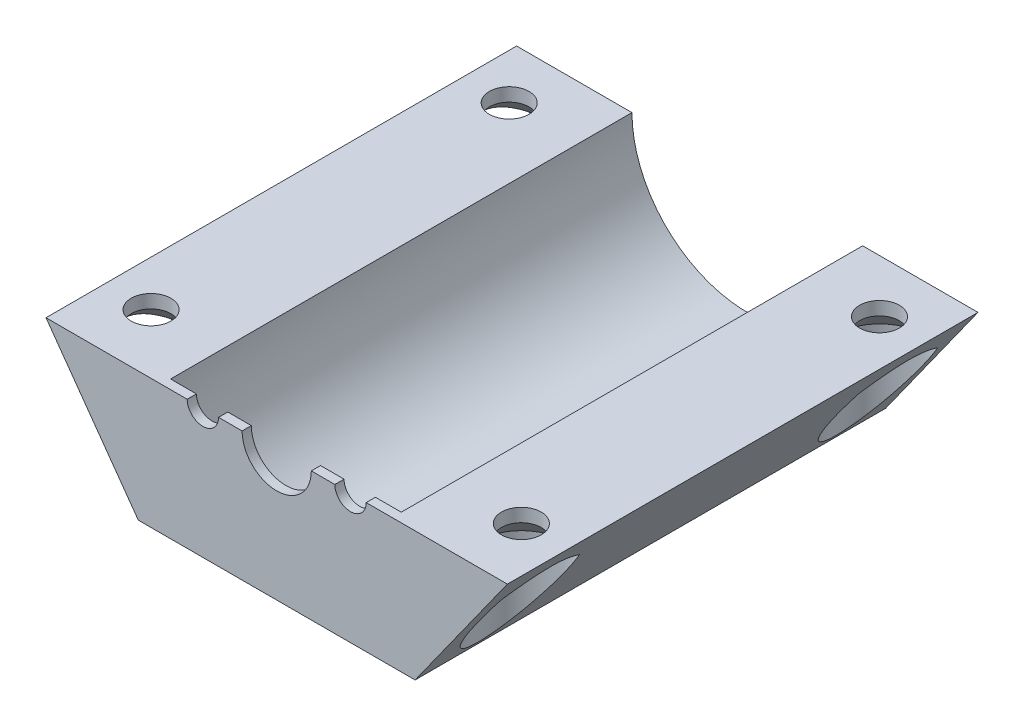
ISO-10303-21;
HEADER;
FILE_DESCRIPTION(('STEP AP214'),'2;1');
FILE_NAME('part.step','',(''),(''),'','','');
FILE_SCHEMA(('AUTOMOTIVE_DESIGN { 1 0 10303 214 1 1 1 1 }'));
ENDSEC;
DATA;
#1=APPLICATION_CONTEXT('core data for automotive mechanical design processes');
#2=APPLICATION_PROTOCOL_DEFINITION('international standard','automotive_design',2000,#1);
#3=PRODUCT_CONTEXT('',#1,'mechanical');
#4=PRODUCT('Part','Part','',(#3));
#5=PRODUCT_RELATED_PRODUCT_CATEGORY('part','',(#4));
#6=PRODUCT_DEFINITION_FORMATION('','',#4);
#7=PRODUCT_DEFINITION_CONTEXT('part definition',#1,'design');
#8=PRODUCT_DEFINITION('design','',#6,#7);
#9=PRODUCT_DEFINITION_SHAPE('','',#8);
#10=(LENGTH_UNIT() NAMED_UNIT(*) SI_UNIT(.MILLI.,.METRE.));
#11=(NAMED_UNIT(*) PLANE_ANGLE_UNIT() SI_UNIT($,.RADIAN.));
#12=(NAMED_UNIT(*) SI_UNIT($,.STERADIAN.) SOLID_ANGLE_UNIT());
#13=UNCERTAINTY_MEASURE_WITH_UNIT(LENGTH_MEASURE(1.E-05),#10,'distance_accuracy_value','');
#14=(GEOMETRIC_REPRESENTATION_CONTEXT(3) GLOBAL_UNCERTAINTY_ASSIGNED_CONTEXT((#13)) GLOBAL_UNIT_ASSIGNED_CONTEXT((#10,
#11,#12)) REPRESENTATION_CONTEXT('',''));
#15=CARTESIAN_POINT('',(0.,0.,0.));
#16=DIRECTION('',(0.,0.,1.));
#17=DIRECTION('',(1.,0.,0.));
#18=AXIS2_PLACEMENT_3D('',#15,#16,#17);
#19=CARTESIAN_POINT('',(0.,0.,0.));
#20=DIRECTION('',(0.,1.,0.));
#21=DIRECTION('',(0.,0.,1.));
#22=AXIS2_PLACEMENT_3D('',#19,#20,#21);
#23=PLANE('',#22);
#24=DIRECTION('',(0.,0.,-1.));
#25=VECTOR('',#24,1.);
#26=CARTESIAN_POINT('',(3.75,0.,51.));
#27=LINE('',#26,#25);
#28=CARTESIAN_POINT('',(3.75,0.,51.));
#29=VERTEX_POINT('',#28);
#30=CARTESIAN_POINT('',(3.75,0.,50.));
#31=VERTEX_POINT('',#30);
#32=EDGE_CURVE('E231',#29,#31,#27,.T.);
#33=ORIENTED_EDGE('',*,*,#32,.F.);
#34=DIRECTION('',(-1.,0.,0.));
#35=VECTOR('',#34,1.);
#36=CARTESIAN_POINT('',(0.,0.,51.));
#37=LINE('',#36,#35);
#38=CARTESIAN_POINT('',(6.3,0.,51.));
#39=VERTEX_POINT('',#38);
#40=EDGE_CURVE('E176',#39,#29,#37,.T.);
#41=ORIENTED_EDGE('',*,*,#40,.F.);
#42=DIRECTION('',(0.,0.,1.));
#43=VECTOR('',#42,1.);
#44=CARTESIAN_POINT('',(6.30000000000001,0.,51.));
#45=LINE('',#44,#43);
#46=CARTESIAN_POINT('',(6.30000000000001,0.,50.));
#47=VERTEX_POINT('',#46);
#48=EDGE_CURVE('E256',#39,#47,#45,.F.);
#49=ORIENTED_EDGE('',*,*,#48,.T.);
#50=DIRECTION('',(-1.,0.,0.));
#51=VECTOR('',#50,1.);
#52=CARTESIAN_POINT('',(0.,0.,50.));
#53=LINE('',#52,#51);
#54=EDGE_CURVE('E224',#47,#31,#53,.T.);
#55=ORIENTED_EDGE('',*,*,#54,.T.);
#56=EDGE_LOOP('',(#33,#41,#49,#55));
#57=FACE_BOUND('',#56,.T.);
#58=ADVANCED_FACE('F41',(#57),#23,.T.);
#59=CARTESIAN_POINT('',(20.0634652174544,0.,44.5527588301009));
#60=DIRECTION('',(0.,1.,0.));
#61=DIRECTION('',(0.,0.,1.));
#62=AXIS2_PLACEMENT_3D('',#59,#60,#61);
#63=CIRCLE('',#62,2.15);
#64=CARTESIAN_POINT('',(20.0634652174544,0.,46.7027588301009));
#65=VERTEX_POINT('',#64);
#66=EDGE_CURVE('E243',#65,#65,#63,.F.);
#67=ORIENTED_EDGE('',*,*,#66,.T.);
#68=EDGE_LOOP('',(#67));
#69=FACE_BOUND('',#68,.T.);
#70=DIRECTION('',(0.,0.,-1.));
#71=VECTOR('',#70,1.);
#72=CARTESIAN_POINT('',(25.,0.,50.));
#73=LINE('',#72,#71);
#74=CARTESIAN_POINT('',(25.,0.,51.));
#75=VERTEX_POINT('',#74);
#76=CARTESIAN_POINT('',(25.,0.,0.));
#77=VERTEX_POINT('',#76);
#78=EDGE_CURVE('E172',#75,#77,#73,.T.);
#79=ORIENTED_EDGE('',*,*,#78,.T.);
#80=DIRECTION('',(-1.,0.,0.));
#81=VECTOR('',#80,1.);
#82=CARTESIAN_POINT('',(0.,0.,0.));
#83=LINE('',#82,#81);
#84=CARTESIAN_POINT('',(12.5,0.,0.));
#85=VERTEX_POINT('',#84);
#86=EDGE_CURVE('E240',#77,#85,#83,.T.);
#87=ORIENTED_EDGE('',*,*,#86,.T.);
#88=DIRECTION('',(0.,0.,-1.));
#89=VECTOR('',#88,1.);
#90=CARTESIAN_POINT('',(12.5,0.,50.));
#91=LINE('',#90,#89);
#92=CARTESIAN_POINT('',(12.5,0.,50.));
#93=VERTEX_POINT('',#92);
#94=EDGE_CURVE('E237',#93,#85,#91,.T.);
#95=ORIENTED_EDGE('',*,*,#94,.F.);
#96=CARTESIAN_POINT('',(9.69999999999999,0.,50.));
#97=VERTEX_POINT('',#96);
#98=EDGE_CURVE('E254',#93,#97,#53,.T.);
#99=ORIENTED_EDGE('',*,*,#98,.T.);
#100=DIRECTION('',(0.,0.,1.));
#101=VECTOR('',#100,1.);
#102=CARTESIAN_POINT('',(9.69999999999999,0.,51.));
#103=LINE('',#102,#101);
#104=CARTESIAN_POINT('',(9.7,0.,51.));
#105=VERTEX_POINT('',#104);
#106=EDGE_CURVE('E175',#97,#105,#103,.T.);
#107=ORIENTED_EDGE('',*,*,#106,.T.);
#108=EDGE_CURVE('E159',#75,#105,#37,.T.);
#109=ORIENTED_EDGE('',*,*,#108,.F.);
#110=EDGE_LOOP('',(#79,#87,#95,#99,#107,#109));
#111=FACE_BOUND('',#110,.T.);
#112=CARTESIAN_POINT('',(20.0634652174544,0.,5.73907339124369));
#113=DIRECTION('',(0.,1.,0.));
#114=DIRECTION('',(0.,0.,1.));
#115=AXIS2_PLACEMENT_3D('',#112,#113,#114);
#116=CIRCLE('',#115,2.15);
#117=CARTESIAN_POINT('',(20.0634652174544,0.,7.88907339124369));
#118=VERTEX_POINT('',#117);
#119=EDGE_CURVE('E252',#118,#118,#116,.F.);
#120=ORIENTED_EDGE('',*,*,#119,.T.);
#121=EDGE_LOOP('',(#120));
#122=FACE_BOUND('',#121,.T.);
#123=ADVANCED_FACE('F169',(#69,#111,#122),#23,.T.);
#124=CARTESIAN_POINT('',(-20.0634652174544,0.,44.5527588301009));
#125=DIRECTION('',(0.,1.,0.));
#126=DIRECTION('',(0.,0.,1.));
#127=AXIS2_PLACEMENT_3D('',#124,#125,#126);
#128=CIRCLE('',#127,2.15);
#129=CARTESIAN_POINT('',(-20.0634652174544,0.,46.7027588301009));
#130=VERTEX_POINT('',#129);
#131=EDGE_CURVE('E246',#130,#130,#128,.F.);
#132=ORIENTED_EDGE('',*,*,#131,.T.);
#133=EDGE_LOOP('',(#132));
#134=FACE_BOUND('',#133,.T.);
#135=DIRECTION('',(0.,0.,-1.));
#136=VECTOR('',#135,1.);
#137=CARTESIAN_POINT('',(-12.5,0.,50.));
#138=LINE('',#137,#136);
#139=CARTESIAN_POINT('',(-12.5,0.,0.));
#140=VERTEX_POINT('',#139);
#141=CARTESIAN_POINT('',(-12.5,0.,50.));
#142=VERTEX_POINT('',#141);
#143=EDGE_CURVE('E177',#140,#142,#138,.F.);
#144=ORIENTED_EDGE('',*,*,#143,.F.);
#145=CARTESIAN_POINT('',(-25.,0.,0.));
#146=VERTEX_POINT('',#145);
#147=EDGE_CURVE('E241',#140,#146,#83,.T.);
#148=ORIENTED_EDGE('',*,*,#147,.T.);
#149=DIRECTION('',(0.,0.,-1.));
#150=VECTOR('',#149,1.);
#151=CARTESIAN_POINT('',(-25.,0.,50.));
#152=LINE('',#151,#150);
#153=CARTESIAN_POINT('',(-25.,0.,51.));
#154=VERTEX_POINT('',#153);
#155=EDGE_CURVE('E56',#154,#146,#152,.T.);
#156=ORIENTED_EDGE('',*,*,#155,.F.);
#157=CARTESIAN_POINT('',(-9.7,0.,51.));
#158=VERTEX_POINT('',#157);
#159=EDGE_CURVE('E179',#158,#154,#37,.T.);
#160=ORIENTED_EDGE('',*,*,#159,.F.);
#161=DIRECTION('',(0.,0.,1.));
#162=VECTOR('',#161,1.);
#163=CARTESIAN_POINT('',(-9.69999999999999,0.,51.));
#164=LINE('',#163,#162);
#165=CARTESIAN_POINT('',(-9.69999999999999,0.,50.));
#166=VERTEX_POINT('',#165);
#167=EDGE_CURVE('E187',#158,#166,#164,.F.);
#168=ORIENTED_EDGE('',*,*,#167,.T.);
#169=EDGE_CURVE('E215',#166,#142,#53,.T.);
#170=ORIENTED_EDGE('',*,*,#169,.T.);
#171=EDGE_LOOP('',(#144,#148,#156,#160,#168,#170));
#172=FACE_BOUND('',#171,.T.);
#173=CARTESIAN_POINT('',(-20.0634652174544,0.,5.73907339124369));
#174=DIRECTION('',(0.,1.,0.));
#175=DIRECTION('',(0.,0.,1.));
#176=AXIS2_PLACEMENT_3D('',#173,#174,#175);
#177=CIRCLE('',#176,2.15);
#178=CARTESIAN_POINT('',(-20.0634652174544,0.,7.88907339124369));
#179=VERTEX_POINT('',#178);
#180=EDGE_CURVE('E249',#179,#179,#177,.F.);
#181=ORIENTED_EDGE('',*,*,#180,.T.);
#182=EDGE_LOOP('',(#181));
#183=FACE_BOUND('',#182,.T.);
#184=ADVANCED_FACE('F260',(#134,#172,#183),#23,.T.);
#185=DIRECTION('',(0.,0.,-1.));
#186=VECTOR('',#185,1.);
#187=CARTESIAN_POINT('',(-3.75,0.,51.));
#188=LINE('',#187,#186);
#189=CARTESIAN_POINT('',(-3.75,0.,50.));
#190=VERTEX_POINT('',#189);
#191=CARTESIAN_POINT('',(-3.75,0.,51.));
#192=VERTEX_POINT('',#191);
#193=EDGE_CURVE('E223',#190,#192,#188,.F.);
#194=ORIENTED_EDGE('',*,*,#193,.F.);
#195=CARTESIAN_POINT('',(-6.30000000000001,0.,50.));
#196=VERTEX_POINT('',#195);
#197=EDGE_CURVE('E212',#190,#196,#53,.T.);
#198=ORIENTED_EDGE('',*,*,#197,.T.);
#199=DIRECTION('',(0.,0.,1.));
#200=VECTOR('',#199,1.);
#201=CARTESIAN_POINT('',(-6.30000000000001,0.,51.));
#202=LINE('',#201,#200);
#203=CARTESIAN_POINT('',(-6.3,0.,51.));
#204=VERTEX_POINT('',#203);
#205=EDGE_CURVE('E184',#196,#204,#202,.T.);
#206=ORIENTED_EDGE('',*,*,#205,.T.);
#207=EDGE_CURVE('E229',#192,#204,#37,.T.);
#208=ORIENTED_EDGE('',*,*,#207,.F.);
#209=EDGE_LOOP('',(#194,#198,#206,#208));
#210=FACE_BOUND('',#209,.T.);
#211=ADVANCED_FACE('F221',(#210),#23,.T.);
#212=CARTESIAN_POINT('',(0.,0.,50.));
#213=DIRECTION('',(0.,0.,-1.));
#214=DIRECTION('',(-1.,0.,0.));
#215=AXIS2_PLACEMENT_3D('',#212,#213,#214);
#216=CYLINDRICAL_SURFACE('',#215,12.5);
#217=CARTESIAN_POINT('',(0.,0.,50.));
#218=DIRECTION('',(0.,0.,1.));
#219=DIRECTION('',(1.,0.,0.));
#220=AXIS2_PLACEMENT_3D('',#217,#218,#219);
#221=CIRCLE('',#220,12.5);
#222=EDGE_CURVE('E165',#142,#93,#221,.T.);
#223=ORIENTED_EDGE('',*,*,#222,.T.);
#224=ORIENTED_EDGE('',*,*,#94,.T.);
#225=CARTESIAN_POINT('',(0.,0.,0.));
#226=DIRECTION('',(0.,0.,1.));
#227=DIRECTION('',(1.,0.,0.));
#228=AXIS2_PLACEMENT_3D('',#225,#226,#227);
#229=CIRCLE('',#228,12.5);
#230=EDGE_CURVE('E191',#140,#85,#229,.T.);
#231=ORIENTED_EDGE('',*,*,#230,.F.);
#232=ORIENTED_EDGE('',*,*,#143,.T.);
#233=EDGE_LOOP('',(#223,#224,#231,#232));
#234=FACE_BOUND('',#233,.T.);
#235=ADVANCED_FACE('F289',(#234),#216,.F.);
#236=CARTESIAN_POINT('',(0.,0.,0.));
#237=DIRECTION('',(0.,0.,1.));
#238=DIRECTION('',(1.,0.,0.));
#239=AXIS2_PLACEMENT_3D('',#236,#237,#238);
#240=PLANE('',#239);
#241=ORIENTED_EDGE('',*,*,#86,.F.);
#242=DIRECTION('',(0.581238193719096,0.813733471206735,0.));
#243=VECTOR('',#242,1.);
#244=CARTESIAN_POINT('',(16.5540540540541,-11.8243243243243,0.));
#245=LINE('',#244,#243);
#246=CARTESIAN_POINT('',(15.,-14.,0.));
#247=VERTEX_POINT('',#246);
#248=EDGE_CURVE('E182',#247,#77,#245,.T.);
#249=ORIENTED_EDGE('',*,*,#248,.F.);
#250=DIRECTION('',(-1.,0.,0.));
#251=VECTOR('',#250,1.);
#252=CARTESIAN_POINT('',(0.,-14.,0.));
#253=LINE('',#252,#251);
#254=CARTESIAN_POINT('',(-15.,-14.,0.));
#255=VERTEX_POINT('',#254);
#256=EDGE_CURVE('E572',#247,#255,#253,.T.);
#257=ORIENTED_EDGE('',*,*,#256,.T.);
#258=DIRECTION('',(0.581238193719096,-0.813733471206735,0.));
#259=VECTOR('',#258,1.);
#260=CARTESIAN_POINT('',(-16.5540540540541,-11.8243243243243,0.));
#261=LINE('',#260,#259);
#262=EDGE_CURVE('E568',#146,#255,#261,.T.);
#263=ORIENTED_EDGE('',*,*,#262,.F.);
#264=ORIENTED_EDGE('',*,*,#147,.F.);
#265=ORIENTED_EDGE('',*,*,#230,.T.);
#266=EDGE_LOOP('',(#241,#249,#257,#263,#264,#265));
#267=FACE_BOUND('',#266,.T.);
#268=ADVANCED_FACE('F43',(#267),#240,.F.);
#269=CARTESIAN_POINT('',(20.0634652174544,-14.,44.5527588301009));
#270=DIRECTION('',(0.,-1.,0.));
#271=DIRECTION('',(0.,0.,-1.));
#272=AXIS2_PLACEMENT_3D('',#269,#270,#271);
#273=CYLINDRICAL_SURFACE('',#272,2.15);
#274=CARTESIAN_POINT('',(20.0634652174544,-1.45,44.5527588301009));
#275=DIRECTION('',(0.,-1.,0.));
#276=DIRECTION('',(0.,0.,-1.));
#277=AXIS2_PLACEMENT_3D('',#274,#275,#276);
#278=CIRCLE('',#277,2.15);
#279=CARTESIAN_POINT('',(20.0634652174544,-1.45,42.4027588301009));
#280=VERTEX_POINT('',#279);
#281=EDGE_CURVE('E566',#280,#280,#278,.T.);
#282=ORIENTED_EDGE('',*,*,#281,.T.);
#283=EDGE_LOOP('',(#282));
#284=FACE_BOUND('',#283,.T.);
#285=ORIENTED_EDGE('',*,*,#66,.F.);
#286=EDGE_LOOP('',(#285));
#287=FACE_BOUND('',#286,.T.);
#288=ADVANCED_FACE('F297',(#284,#287),#273,.F.);
#289=CARTESIAN_POINT('',(-20.0634652174544,-14.,44.5527588301009));
#290=DIRECTION('',(0.,-1.,0.));
#291=DIRECTION('',(0.,0.,-1.));
#292=AXIS2_PLACEMENT_3D('',#289,#290,#291);
#293=CYLINDRICAL_SURFACE('',#292,2.15);
#294=CARTESIAN_POINT('',(-20.0634652174544,-1.45000000000001,44.5527588301009));
#295=DIRECTION('',(0.,-1.,0.));
#296=DIRECTION('',(0.,0.,-1.));
#297=AXIS2_PLACEMENT_3D('',#294,#295,#296);
#298=CIRCLE('',#297,2.15);
#299=CARTESIAN_POINT('',(-20.0634652174544,-1.45000000000001,42.4027588301009));
#300=VERTEX_POINT('',#299);
#301=EDGE_CURVE('E570',#300,#300,#298,.T.);
#302=ORIENTED_EDGE('',*,*,#301,.T.);
#303=EDGE_LOOP('',(#302));
#304=FACE_BOUND('',#303,.T.);
#305=ORIENTED_EDGE('',*,*,#131,.F.);
#306=EDGE_LOOP('',(#305));
#307=FACE_BOUND('',#306,.T.);
#308=ADVANCED_FACE('F474',(#304,#307),#293,.F.);
#309=CARTESIAN_POINT('',(-20.0634652174544,-14.,5.73907339124369));
#310=DIRECTION('',(0.,-1.,0.));
#311=DIRECTION('',(0.,0.,-1.));
#312=AXIS2_PLACEMENT_3D('',#309,#310,#311);
#313=CYLINDRICAL_SURFACE('',#312,2.15);
#314=CARTESIAN_POINT('',(-20.0634652174544,-1.45000000000001,5.73907339124369));
#315=DIRECTION('',(0.,-1.,0.));
#316=DIRECTION('',(0.,0.,-1.));
#317=AXIS2_PLACEMENT_3D('',#314,#315,#316);
#318=CIRCLE('',#317,2.15);
#319=CARTESIAN_POINT('',(-20.0634652174544,-1.45000000000001,3.58907339124369));
#320=VERTEX_POINT('',#319);
#321=EDGE_CURVE('E580',#320,#320,#318,.T.);
#322=ORIENTED_EDGE('',*,*,#321,.T.);
#323=EDGE_LOOP('',(#322));
#324=FACE_BOUND('',#323,.T.);
#325=ORIENTED_EDGE('',*,*,#180,.F.);
#326=EDGE_LOOP('',(#325));
#327=FACE_BOUND('',#326,.T.);
#328=ADVANCED_FACE('F463',(#324,#327),#313,.F.);
#329=CARTESIAN_POINT('',(20.0634652174544,-14.,5.73907339124369));
#330=DIRECTION('',(0.,-1.,0.));
#331=DIRECTION('',(0.,0.,-1.));
#332=AXIS2_PLACEMENT_3D('',#329,#330,#331);
#333=CYLINDRICAL_SURFACE('',#332,2.15);
#334=CARTESIAN_POINT('',(20.0634652174544,-1.45,5.73907339124369));
#335=DIRECTION('',(0.,-1.,0.));
#336=DIRECTION('',(0.,0.,-1.));
#337=AXIS2_PLACEMENT_3D('',#334,#335,#336);
#338=CIRCLE('',#337,2.15);
#339=CARTESIAN_POINT('',(20.0634652174544,-1.45,3.58907339124369));
#340=VERTEX_POINT('',#339);
#341=EDGE_CURVE('E585',#340,#340,#338,.T.);
#342=ORIENTED_EDGE('',*,*,#341,.T.);
#343=EDGE_LOOP('',(#342));
#344=FACE_BOUND('',#343,.T.);
#345=ORIENTED_EDGE('',*,*,#119,.F.);
#346=EDGE_LOOP('',(#345));
#347=FACE_BOUND('',#346,.T.);
#348=ADVANCED_FACE('F304',(#344,#347),#333,.F.);
#349=CARTESIAN_POINT('',(0.,0.,50.));
#350=DIRECTION('',(0.,0.,1.));
#351=DIRECTION('',(1.,0.,0.));
#352=AXIS2_PLACEMENT_3D('',#349,#350,#351);
#353=PLANE('',#352);
#354=ORIENTED_EDGE('',*,*,#98,.F.);
#355=ORIENTED_EDGE('',*,*,#222,.F.);
#356=ORIENTED_EDGE('',*,*,#169,.F.);
#357=CARTESIAN_POINT('',(-8.,0.,50.));
#358=DIRECTION('',(0.,0.,1.));
#359=DIRECTION('',(1.,0.,0.));
#360=AXIS2_PLACEMENT_3D('',#357,#358,#359);
#361=CIRCLE('',#360,1.69999999999999);
#362=EDGE_CURVE('E49',#166,#196,#361,.T.);
#363=ORIENTED_EDGE('',*,*,#362,.T.);
#364=ORIENTED_EDGE('',*,*,#197,.F.);
#365=CARTESIAN_POINT('',(0.,0.,50.));
#366=DIRECTION('',(0.,0.,1.));
#367=DIRECTION('',(1.,0.,0.));
#368=AXIS2_PLACEMENT_3D('',#365,#366,#367);
#369=CIRCLE('',#368,3.75);
#370=EDGE_CURVE('E199',#190,#31,#369,.T.);
#371=ORIENTED_EDGE('',*,*,#370,.T.);
#372=ORIENTED_EDGE('',*,*,#54,.F.);
#373=CARTESIAN_POINT('',(8.,0.,50.));
#374=DIRECTION('',(0.,0.,1.));
#375=DIRECTION('',(1.,0.,0.));
#376=AXIS2_PLACEMENT_3D('',#373,#374,#375);
#377=CIRCLE('',#376,1.69999999999999);
#378=EDGE_CURVE('E203',#47,#97,#377,.T.);
#379=ORIENTED_EDGE('',*,*,#378,.T.);
#380=EDGE_LOOP('',(#354,#355,#356,#363,#364,#371,#372,#379));
#381=FACE_BOUND('',#380,.T.);
#382=ADVANCED_FACE('F211',(#381),#353,.F.);
#383=CARTESIAN_POINT('',(0.,0.,51.));
#384=DIRECTION('',(0.,0.,1.));
#385=DIRECTION('',(1.,0.,0.));
#386=AXIS2_PLACEMENT_3D('',#383,#384,#385);
#387=PLANE('',#386);
#388=DIRECTION('',(0.581238193719096,0.813733471206735,0.));
#389=VECTOR('',#388,1.);
#390=CARTESIAN_POINT('',(15.,-14.,51.));
#391=LINE('',#390,#389);
#392=CARTESIAN_POINT('',(15.,-14.,51.));
#393=VERTEX_POINT('',#392);
#394=EDGE_CURVE('E156',#393,#75,#391,.T.);
#395=ORIENTED_EDGE('',*,*,#394,.T.);
#396=ORIENTED_EDGE('',*,*,#108,.T.);
#397=CARTESIAN_POINT('',(8.,0.,51.));
#398=DIRECTION('',(0.,0.,1.));
#399=DIRECTION('',(1.,0.,0.));
#400=AXIS2_PLACEMENT_3D('',#397,#398,#399);
#401=CIRCLE('',#400,1.7);
#402=EDGE_CURVE('E205',#39,#105,#401,.T.);
#403=ORIENTED_EDGE('',*,*,#402,.F.);
#404=ORIENTED_EDGE('',*,*,#40,.T.);
#405=CARTESIAN_POINT('',(0.,0.,51.));
#406=DIRECTION('',(0.,0.,1.));
#407=DIRECTION('',(1.,0.,0.));
#408=AXIS2_PLACEMENT_3D('',#405,#406,#407);
#409=CIRCLE('',#408,3.75);
#410=EDGE_CURVE('E196',#192,#29,#409,.T.);
#411=ORIENTED_EDGE('',*,*,#410,.F.);
#412=ORIENTED_EDGE('',*,*,#207,.T.);
#413=CARTESIAN_POINT('',(-8.,0.,51.));
#414=DIRECTION('',(0.,0.,1.));
#415=DIRECTION('',(1.,0.,0.));
#416=AXIS2_PLACEMENT_3D('',#413,#414,#415);
#417=CIRCLE('',#416,1.7);
#418=EDGE_CURVE('E11',#158,#204,#417,.T.);
#419=ORIENTED_EDGE('',*,*,#418,.F.);
#420=ORIENTED_EDGE('',*,*,#159,.T.);
#421=DIRECTION('',(0.581238193719096,-0.813733471206735,0.));
#422=VECTOR('',#421,1.);
#423=CARTESIAN_POINT('',(-25.,0.,51.));
#424=LINE('',#423,#422);
#425=CARTESIAN_POINT('',(-15.,-14.,51.));
#426=VERTEX_POINT('',#425);
#427=EDGE_CURVE('E200',#154,#426,#424,.T.);
#428=ORIENTED_EDGE('',*,*,#427,.T.);
#429=DIRECTION('',(1.,0.,0.));
#430=VECTOR('',#429,1.);
#431=CARTESIAN_POINT('',(-15.,-14.,51.));
#432=LINE('',#431,#430);
#433=EDGE_CURVE('E162',#426,#393,#432,.T.);
#434=ORIENTED_EDGE('',*,*,#433,.T.);
#435=EDGE_LOOP('',(#395,#396,#403,#404,#411,#412,#419,#420,#428,#434));
#436=FACE_BOUND('',#435,.T.);
#437=ADVANCED_FACE('F158',(#436),#387,.T.);
#438=CARTESIAN_POINT('',(0.,0.,51.));
#439=DIRECTION('',(0.,0.,-1.));
#440=DIRECTION('',(-1.,0.,0.));
#441=AXIS2_PLACEMENT_3D('',#438,#439,#440);
#442=CYLINDRICAL_SURFACE('',#441,3.75);
#443=ORIENTED_EDGE('',*,*,#410,.T.);
#444=ORIENTED_EDGE('',*,*,#32,.T.);
#445=ORIENTED_EDGE('',*,*,#370,.F.);
#446=ORIENTED_EDGE('',*,*,#193,.T.);
#447=EDGE_LOOP('',(#443,#444,#445,#446));
#448=FACE_BOUND('',#447,.T.);
#449=ADVANCED_FACE('F273',(#448),#442,.F.);
#450=CARTESIAN_POINT('',(8.,0.,51.));
#451=DIRECTION('',(0.,0.,1.));
#452=DIRECTION('',(1.,0.,0.));
#453=AXIS2_PLACEMENT_3D('',#450,#451,#452);
#454=CYLINDRICAL_SURFACE('',#453,1.69999999999999);
#455=ORIENTED_EDGE('',*,*,#48,.F.);
#456=ORIENTED_EDGE('',*,*,#402,.T.);
#457=ORIENTED_EDGE('',*,*,#106,.F.);
#458=ORIENTED_EDGE('',*,*,#378,.F.);
#459=EDGE_LOOP('',(#455,#456,#457,#458));
#460=FACE_BOUND('',#459,.T.);
#461=ADVANCED_FACE('F280',(#460),#454,.F.);
#462=CARTESIAN_POINT('',(-8.,0.,51.));
#463=DIRECTION('',(0.,0.,1.));
#464=DIRECTION('',(1.,0.,0.));
#465=AXIS2_PLACEMENT_3D('',#462,#463,#464);
#466=CYLINDRICAL_SURFACE('',#465,1.69999999999999);
#467=ORIENTED_EDGE('',*,*,#167,.F.);
#468=ORIENTED_EDGE('',*,*,#418,.T.);
#469=ORIENTED_EDGE('',*,*,#205,.F.);
#470=ORIENTED_EDGE('',*,*,#362,.F.);
#471=EDGE_LOOP('',(#467,#468,#469,#470));
#472=FACE_BOUND('',#471,.T.);
#473=ADVANCED_FACE('F226',(#472),#466,.F.);
#474=CARTESIAN_POINT('',(-16.5540540540541,-11.8243243243243,50.));
#475=DIRECTION('',(0.813733471206735,0.581238193719096,0.));
#476=DIRECTION('',(-0.581238193719096,0.813733471206735,0.));
#477=AXIS2_PLACEMENT_3D('',#474,#475,#476);
#478=PLANE('',#477);
#479=CARTESIAN_POINT('',(-22.1427142857143,-4.0002,1.52379127113118));
#480=CARTESIAN_POINT('',(-22.1854261770996,-3.94040335206059,1.61154536666589));
#481=CARTESIAN_POINT('',(-22.2275411791603,-3.88144234917553,1.70017000831957));
#482=CARTESIAN_POINT('',(-22.3104092844478,-3.76542700177312,1.87932199170733));
#483=CARTESIAN_POINT('',(-22.351162013433,-3.70837318119385,1.96984984534189));
#484=CARTESIAN_POINT('',(-22.4313005044899,-3.59617929371415,2.15334928706207));
#485=CARTESIAN_POINT('',(-22.4706790011466,-3.54104939839482,2.24633030658628));
#486=CARTESIAN_POINT('',(-22.547638939344,-3.43330548491835,2.4344531648223));
#487=CARTESIAN_POINT('',(-22.5852205110463,-3.38069128453515,2.5295948462865));
#488=CARTESIAN_POINT('',(-22.6965981705425,-3.22476256124051,2.82293171027622));
#489=CARTESIAN_POINT('',(-22.767159373316,-3.12597687735759,3.02483235620082));
#490=CARTESIAN_POINT('',(-22.896934904765,-2.94429113332899,3.4388631921025));
#491=CARTESIAN_POINT('',(-22.9561712046473,-2.86136031349372,3.65097255416088));
#492=CARTESIAN_POINT('',(-23.0381469418858,-2.74659428135992,3.99401520707284));
#493=CARTESIAN_POINT('',(-23.0657509408178,-2.70794868285502,4.12151810955079));
#494=CARTESIAN_POINT('',(-23.1153490186372,-2.63851137390788,4.37975872876677));
#495=CARTESIAN_POINT('',(-23.1373427712984,-2.60772012018222,4.51049663312987));
#496=CARTESIAN_POINT('',(-23.1748805576289,-2.55516721931947,4.77364851863538));
#497=CARTESIAN_POINT('',(-23.1904725742941,-2.5333383959882,4.90604206889438));
#498=CARTESIAN_POINT('',(-23.2148849636386,-2.499161050906,5.17267545587519));
#499=CARTESIAN_POINT('',(-23.2237057707758,-2.48681192091387,5.30691517357955));
#500=CARTESIAN_POINT('',(-23.2342670061193,-2.47202619143302,5.57732410743552));
#501=CARTESIAN_POINT('',(-23.2359492468554,-2.46967105440238,5.71350013614007));
#502=CARTESIAN_POINT('',(-23.2320025564072,-2.47519642102986,5.98553414461369));
#503=CARTESIAN_POINT('',(-23.2263736062576,-2.48307695123942,6.12139212355683));
#504=CARTESIAN_POINT('',(-23.2080154701058,-2.5087783418519,6.39202260834649));
#505=CARTESIAN_POINT('',(-23.1952679894372,-2.52662481478793,6.52679140592947));
#506=CARTESIAN_POINT('',(-23.1631552619844,-2.57158263322188,6.79396149814653));
#507=CARTESIAN_POINT('',(-23.1437891332344,-2.59869521347178,6.9263624747818));
#508=CARTESIAN_POINT('',(-23.0920250352467,-2.67116495065467,7.22951332760511));
#509=CARTESIAN_POINT('',(-23.0574428097643,-2.71958006632996,7.39915934789908));
#510=CARTESIAN_POINT('',(-22.9795864195486,-2.82857901263189,7.73243058753107));
#511=CARTESIAN_POINT('',(-22.9363081156809,-2.88916863804676,7.89605289567083));
#512=CARTESIAN_POINT('',(-22.8424813655124,-3.02052608828262,8.21762261748195));
#513=CARTESIAN_POINT('',(-22.7919094462166,-3.0913267752968,8.37554956776795));
#514=CARTESIAN_POINT('',(-22.6849716824596,-3.24103964455659,8.68538487185059));
#515=CARTESIAN_POINT('',(-22.6286070257126,-3.31995016400232,8.83729445060502));
#516=CARTESIAN_POINT('',(-22.5035597449754,-3.49501635703448,9.15496055255297));
#517=CARTESIAN_POINT('',(-22.4342276575697,-3.59208127940245,9.3199575256071));
#518=CARTESIAN_POINT('',(-22.3269800496922,-3.74222793043092,9.56204377379806));
#519=CARTESIAN_POINT('',(-22.2908508640619,-3.79280879031338,9.64150866924409));
#520=CARTESIAN_POINT('',(-22.2175420257489,-3.89544116395155,9.79899165899484));
#521=CARTESIAN_POINT('',(-22.1803623765923,-3.9474926727708,9.8770097581545));
#522=CARTESIAN_POINT('',(-22.1427142857143,-4.0002,9.9543555113562));
#523=B_SPLINE_CURVE_WITH_KNOTS('',3,(#479,#480,#481,#482,#483,#484,#485,#486,#487,#488,#489,
#490,#491,#492,#493,#494,#495,#496,#497,#498,#499,#500,#501,#502,#503,#504,#505,#506,#507,#508,
#509,#510,#511,#512,#513,#514,#515,#516,#517,#518,#519,#520,#521,#522),.UNSPECIFIED.,.F.,.F.,(4,
2,2,2,2,2,2,2,2,2,2,2,2,2,2,2,2,2,2,2,2,4),(0.,0.343378820737613,0.686851211395891,
1.03192622400694,1.37697620289018,2.08292136184729,2.7874827151489,3.19534392273691,
3.6032288413456,4.00799812567784,4.4127414368134,4.82077760607925,5.22881483379728,
5.63790557810192,6.04705085692267,6.58549575746693,7.12419755517182,7.6646734305074,
8.20503870959644,8.81549068100099,9.11813487893505,9.42077806111756),.UNSPECIFIED.);
#524=CARTESIAN_POINT('',(-22.1428571428571,-4.,1.5240847529945));
#525=VERTEX_POINT('',#524);
#526=CARTESIAN_POINT('',(-22.1428571428571,-4.,9.95406202949288));
#527=VERTEX_POINT('',#526);
#528=EDGE_CURVE('E596',#525,#527,#523,.T.);
#529=ORIENTED_EDGE('',*,*,#528,.T.);
#530=CARTESIAN_POINT('',(-20.0634652174544,-6.91114869556388,5.73907339124369));
#531=DIRECTION('',(0.813733471206735,0.581238193719096,0.));
#532=DIRECTION('',(0.581238193719096,-0.813733471206735,0.));
#533=AXIS2_PLACEMENT_3D('',#530,#531,#532);
#534=ELLIPSE('',#533,8.08618575102007,4.7);
#535=EDGE_CURVE('E593',#527,#525,#534,.T.);
#536=ORIENTED_EDGE('',*,*,#535,.T.);
#537=EDGE_LOOP('',(#529,#536));
#538=FACE_BOUND('',#537,.T.);
#539=CARTESIAN_POINT('',(-22.1427142857143,-4.00020000000002,40.3374767099884));
#540=CARTESIAN_POINT('',(-22.1854261770996,-3.9404033520606,40.4252308055231));
#541=CARTESIAN_POINT('',(-22.2275411791603,-3.88144234917554,40.5138554471768));
#542=CARTESIAN_POINT('',(-22.3104092844478,-3.76542700177314,40.6930074305645));
#543=CARTESIAN_POINT('',(-22.351162013433,-3.70837318119387,40.7835352841991));
#544=CARTESIAN_POINT('',(-22.4313005044899,-3.59617929371416,40.9670347259193));
#545=CARTESIAN_POINT('',(-22.4706790011466,-3.54104939839483,41.0600157454435));
#546=CARTESIAN_POINT('',(-22.547638939344,-3.43330548491836,41.2481386036795));
#547=CARTESIAN_POINT('',(-22.5852205110463,-3.38069128453517,41.3432802851437));
#548=CARTESIAN_POINT('',(-22.6965981705425,-3.22476256124052,41.6366171491334));
#549=CARTESIAN_POINT('',(-22.767159373316,-3.1259768773576,41.838517795058));
#550=CARTESIAN_POINT('',(-22.896934904765,-2.944291133329,42.2525486309597));
#551=CARTESIAN_POINT('',(-22.9561712046473,-2.86136031349373,42.4646579930181));
#552=CARTESIAN_POINT('',(-23.0381469418858,-2.74659428135992,42.80770064593));
#553=CARTESIAN_POINT('',(-23.0657509408178,-2.70794868285503,42.935203548408));
#554=CARTESIAN_POINT('',(-23.1153490186372,-2.63851137390789,43.193444167624));
#555=CARTESIAN_POINT('',(-23.1373427712984,-2.60772012018222,43.3241820719871));
#556=CARTESIAN_POINT('',(-23.1748805576289,-2.55516721931947,43.5873339574926));
#557=CARTESIAN_POINT('',(-23.1904725742941,-2.5333383959882,43.7197275077516));
#558=CARTESIAN_POINT('',(-23.2148849636386,-2.499161050906,43.9863608947324));
#559=CARTESIAN_POINT('',(-23.2237057707758,-2.48681192091387,44.1206006124367));
#560=CARTESIAN_POINT('',(-23.2342670061193,-2.47202619143302,44.3910095462927));
#561=CARTESIAN_POINT('',(-23.2359492468554,-2.46967105440238,44.5271855749973));
#562=CARTESIAN_POINT('',(-23.2320025564072,-2.47519642102986,44.7992195834709));
#563=CARTESIAN_POINT('',(-23.2263736062576,-2.48307695123942,44.935077562414));
#564=CARTESIAN_POINT('',(-23.2080154701058,-2.5087783418519,45.2057080472037));
#565=CARTESIAN_POINT('',(-23.1952679894372,-2.52662481478793,45.3404768447867));
#566=CARTESIAN_POINT('',(-23.1631552619844,-2.57158263322188,45.6076469370037));
#567=CARTESIAN_POINT('',(-23.1437891332344,-2.59869521347178,45.740047913639));
#568=CARTESIAN_POINT('',(-23.0920250352467,-2.67116495065467,46.0431987664623));
#569=CARTESIAN_POINT('',(-23.0574428097643,-2.71958006632995,46.2128447867563));
#570=CARTESIAN_POINT('',(-22.9795864195487,-2.82857901263188,46.5461160263883));
#571=CARTESIAN_POINT('',(-22.9363081156809,-2.88916863804676,46.709738334528));
#572=CARTESIAN_POINT('',(-22.8424813655124,-3.02052608828261,47.0313080563391));
#573=CARTESIAN_POINT('',(-22.7919094462166,-3.09132677529679,47.1892350066252));
#574=CARTESIAN_POINT('',(-22.6849716824596,-3.24103964455658,47.4990703107078));
#575=CARTESIAN_POINT('',(-22.6286070257126,-3.31995016400231,47.6509798894622));
#576=CARTESIAN_POINT('',(-22.5035597449754,-3.49501635703448,47.9686459914102));
#577=CARTESIAN_POINT('',(-22.4342276575697,-3.59208127940245,48.1336429644643));
#578=CARTESIAN_POINT('',(-22.3269800496922,-3.74222793043093,48.3757292126553));
#579=CARTESIAN_POINT('',(-22.2908508640619,-3.79280879031339,48.4551941081013));
#580=CARTESIAN_POINT('',(-22.2175420257489,-3.89544116395157,48.6126770978521));
#581=CARTESIAN_POINT('',(-22.1803623765923,-3.94749267277082,48.6906951970117));
#582=CARTESIAN_POINT('',(-22.1427142857143,-4.00020000000002,48.7680409502134));
#583=B_SPLINE_CURVE_WITH_KNOTS('',3,(#539,#540,#541,#542,#543,#544,#545,#546,#547,#548,#549,
#550,#551,#552,#553,#554,#555,#556,#557,#558,#559,#560,#561,#562,#563,#564,#565,#566,#567,#568,
#569,#570,#571,#572,#573,#574,#575,#576,#577,#578,#579,#580,#581,#582),.UNSPECIFIED.,.F.,.F.,(4,
2,2,2,2,2,2,2,2,2,2,2,2,2,2,2,2,2,2,2,2,4),(0.,0.343378820737615,0.686851211395895,
1.03192622400695,1.37697620289018,2.08292136184729,2.7874827151489,3.19534392273691,
3.60322884134561,4.00799812567784,4.41274143681341,4.82077760607926,5.2288148337973,
5.63790557810194,6.04705085692269,6.58549575746695,7.12419755517184,7.66467343050742,
8.20503870959646,8.81549068100102,9.1181348789351,9.42077806111763),.UNSPECIFIED.);
#584=CARTESIAN_POINT('',(-22.1428571428571,-4.,40.3377701918517));
#585=VERTEX_POINT('',#584);
#586=CARTESIAN_POINT('',(-22.1428571428571,-4.,48.7677474683501));
#587=VERTEX_POINT('',#586);
#588=EDGE_CURVE('E616',#585,#587,#583,.T.);
#589=ORIENTED_EDGE('',*,*,#588,.T.);
#590=CARTESIAN_POINT('',(-20.0634652174544,-6.91114869556388,44.5527588301009));
#591=DIRECTION('',(0.813733471206735,0.581238193719096,0.));
#592=DIRECTION('',(0.581238193719096,-0.813733471206735,0.));
#593=AXIS2_PLACEMENT_3D('',#590,#591,#592);
#594=ELLIPSE('',#593,8.08618575102007,4.7);
#595=EDGE_CURVE('E612',#587,#585,#594,.T.);
#596=ORIENTED_EDGE('',*,*,#595,.T.);
#597=EDGE_LOOP('',(#589,#596));
#598=FACE_BOUND('',#597,.T.);
#599=ORIENTED_EDGE('',*,*,#262,.T.);
#600=DIRECTION('',(0.,0.,-1.));
#601=VECTOR('',#600,1.);
#602=CARTESIAN_POINT('',(-15.,-14.,50.));
#603=LINE('',#602,#601);
#604=EDGE_CURVE('E64',#426,#255,#603,.T.);
#605=ORIENTED_EDGE('',*,*,#604,.F.);
#606=ORIENTED_EDGE('',*,*,#427,.F.);
#607=ORIENTED_EDGE('',*,*,#155,.T.);
#608=EDGE_LOOP('',(#599,#605,#606,#607));
#609=FACE_BOUND('',#608,.T.);
#610=ADVANCED_FACE('F262',(#538,#598,#609),#478,.F.);
#611=CARTESIAN_POINT('',(0.,-14.,50.));
#612=DIRECTION('',(0.,-1.,0.));
#613=DIRECTION('',(1.,0.,0.));
#614=AXIS2_PLACEMENT_3D('',#611,#612,#613);
#615=PLANE('',#614);
#616=ORIENTED_EDGE('',*,*,#256,.F.);
#617=DIRECTION('',(0.,0.,-1.));
#618=VECTOR('',#617,1.);
#619=CARTESIAN_POINT('',(15.,-14.,50.));
#620=LINE('',#619,#618);
#621=EDGE_CURVE('E193',#393,#247,#620,.T.);
#622=ORIENTED_EDGE('',*,*,#621,.F.);
#623=ORIENTED_EDGE('',*,*,#433,.F.);
#624=ORIENTED_EDGE('',*,*,#604,.T.);
#625=EDGE_LOOP('',(#616,#622,#623,#624));
#626=FACE_BOUND('',#625,.T.);
#627=ADVANCED_FACE('F337',(#626),#615,.T.);
#628=CARTESIAN_POINT('',(16.5540540540541,-11.8243243243243,50.));
#629=DIRECTION('',(-0.813733471206735,0.581238193719096,0.));
#630=DIRECTION('',(-0.581238193719096,-0.813733471206735,0.));
#631=AXIS2_PLACEMENT_3D('',#628,#629,#630);
#632=PLANE('',#631);
#633=CARTESIAN_POINT('',(22.1427142857143,-4.0002,9.95435551135621));
#634=CARTESIAN_POINT('',(22.1854261770996,-3.94040335206058,9.8666014158215));
#635=CARTESIAN_POINT('',(22.2275411791603,-3.88144234917552,9.77797677416782));
#636=CARTESIAN_POINT('',(22.3104092844478,-3.76542700177312,9.59882479078006));
#637=CARTESIAN_POINT('',(22.351162013433,-3.70837318119385,9.5082969371455));
#638=CARTESIAN_POINT('',(22.4313005044899,-3.59617929371414,9.32479749542532));
#639=CARTESIAN_POINT('',(22.4706790011466,-3.54104939839481,9.23181647590111));
#640=CARTESIAN_POINT('',(22.547638939344,-3.43330548491835,9.04369361766509));
#641=CARTESIAN_POINT('',(22.5852205110463,-3.38069128453515,8.94855193620089));
#642=CARTESIAN_POINT('',(22.6965981705425,-3.2247625612405,8.65521507221117));
#643=CARTESIAN_POINT('',(22.767159373316,-3.12597687735758,8.45331442628657));
#644=CARTESIAN_POINT('',(22.896934904765,-2.94429113332898,8.03928359038489));
#645=CARTESIAN_POINT('',(22.9561712046473,-2.86136031349371,7.82717422832651));
#646=CARTESIAN_POINT('',(23.0381469418858,-2.74659428135991,7.48413157541456));
#647=CARTESIAN_POINT('',(23.0657509408179,-2.70794868285501,7.3566286729366));
#648=CARTESIAN_POINT('',(23.1153490186372,-2.63851137390787,7.09838805372063));
#649=CARTESIAN_POINT('',(23.1373427712984,-2.60772012018221,6.96765014935753));
#650=CARTESIAN_POINT('',(23.174880557629,-2.55516721931946,6.70449826385202));
#651=CARTESIAN_POINT('',(23.1904725742942,-2.53333839598819,6.57210471359302));
#652=CARTESIAN_POINT('',(23.2148849636386,-2.49916105090599,6.3054713266122));
#653=CARTESIAN_POINT('',(23.2237057707758,-2.48681192091385,6.17123160890785));
#654=CARTESIAN_POINT('',(23.2342670061193,-2.47202619143301,5.90082267505187));
#655=CARTESIAN_POINT('',(23.2359492468555,-2.46967105440236,5.76464664634733));
#656=CARTESIAN_POINT('',(23.2320025564073,-2.47519642102985,5.4926126378737));
#657=CARTESIAN_POINT('',(23.2263736062576,-2.4830769512394,5.35675465893057));
#658=CARTESIAN_POINT('',(23.2080154701058,-2.50877834185189,5.0861241741409));
#659=CARTESIAN_POINT('',(23.1952679894372,-2.52662481478791,4.95135537655793));
#660=CARTESIAN_POINT('',(23.1631552619844,-2.57158263322187,4.68418528434087));
#661=CARTESIAN_POINT('',(23.1437891332345,-2.59869521347176,4.55178430770559));
#662=CARTESIAN_POINT('',(23.0920250352467,-2.67116495065465,4.24863345488229));
#663=CARTESIAN_POINT('',(23.0574428097643,-2.71958006632994,4.07898743458832));
#664=CARTESIAN_POINT('',(22.9795864195487,-2.82857901263187,3.74571619495633));
#665=CARTESIAN_POINT('',(22.9363081156809,-2.88916863804674,3.58209388681657));
#666=CARTESIAN_POINT('',(22.8424813655124,-3.0205260882826,3.26052416500546));
#667=CARTESIAN_POINT('',(22.7919094462166,-3.09132677529678,3.10259721471945));
#668=CARTESIAN_POINT('',(22.6849716824596,-3.24103964455656,2.79276191063681));
#669=CARTESIAN_POINT('',(22.6286070257127,-3.31995016400229,2.64085233188239));
#670=CARTESIAN_POINT('',(22.5035597449754,-3.49501635703446,2.32318622993443));
#671=CARTESIAN_POINT('',(22.4342276575697,-3.59208127940243,2.1581892568803));
#672=CARTESIAN_POINT('',(22.3269800496922,-3.74222793043091,1.91610300868932));
#673=CARTESIAN_POINT('',(22.2908508640619,-3.79280879031337,1.83663811324329));
#674=CARTESIAN_POINT('',(22.2175420257489,-3.89544116395154,1.67915512349254));
#675=CARTESIAN_POINT('',(22.1803623765923,-3.9474926727708,1.60113702433288));
#676=CARTESIAN_POINT('',(22.1427142857143,-4.0002,1.52379127113117));
#677=B_SPLINE_CURVE_WITH_KNOTS('',3,(#633,#634,#635,#636,#637,#638,#639,#640,#641,#642,#643,
#644,#645,#646,#647,#648,#649,#650,#651,#652,#653,#654,#655,#656,#657,#658,#659,#660,#661,#662,
#663,#664,#665,#666,#667,#668,#669,#670,#671,#672,#673,#674,#675,#676),.UNSPECIFIED.,.F.,.F.,(4,
2,2,2,2,2,2,2,2,2,2,2,2,2,2,2,2,2,2,2,2,4),(0.,0.343378820737611,0.68685121139589,
1.03192622400694,1.37697620289017,2.08292136184729,2.7874827151489,3.19534392273691,
3.6032288413456,4.00799812567784,4.4127414368134,4.82077760607925,5.22881483379728,
5.63790557810192,6.04705085692266,6.58549575746692,7.12419755517181,7.66467343050739,
8.20503870959643,8.81549068100099,9.11813487893506,9.42077806111759),.UNSPECIFIED.);
#678=CARTESIAN_POINT('',(22.1428571428571,-4.,9.95406202949288));
#679=VERTEX_POINT('',#678);
#680=CARTESIAN_POINT('',(22.1428571428571,-4.,1.5240847529945));
#681=VERTEX_POINT('',#680);
#682=EDGE_CURVE('E270',#679,#681,#677,.T.);
#683=ORIENTED_EDGE('',*,*,#682,.T.);
#684=CARTESIAN_POINT('',(20.0634652174544,-6.91114869556385,5.73907339124369));
#685=DIRECTION('',(-0.813733471206735,0.581238193719096,0.));
#686=DIRECTION('',(-0.581238193719096,-0.813733471206735,0.));
#687=AXIS2_PLACEMENT_3D('',#684,#685,#686);
#688=ELLIPSE('',#687,8.08618575102007,4.7);
#689=EDGE_CURVE('E267',#681,#679,#688,.T.);
#690=ORIENTED_EDGE('',*,*,#689,.T.);
#691=EDGE_LOOP('',(#683,#690));
#692=FACE_BOUND('',#691,.T.);
#693=CARTESIAN_POINT('',(22.1427142857143,-4.00020000000001,48.7680409502134));
#694=CARTESIAN_POINT('',(22.1854261770996,-3.94040335206059,48.6802868546787));
#695=CARTESIAN_POINT('',(22.2275411791603,-3.88144234917553,48.5916622130251));
#696=CARTESIAN_POINT('',(22.3104092844478,-3.76542700177313,48.4125102296373));
#697=CARTESIAN_POINT('',(22.351162013433,-3.70837318119385,48.3219823760027));
#698=CARTESIAN_POINT('',(22.4313005044899,-3.59617929371415,48.1384829342825));
#699=CARTESIAN_POINT('',(22.4706790011466,-3.54104939839482,48.0455019147583));
#700=CARTESIAN_POINT('',(22.547638939344,-3.43330548491836,47.8573790565223));
#701=CARTESIAN_POINT('',(22.5852205110463,-3.38069128453516,47.7622373750581));
#702=CARTESIAN_POINT('',(22.6965981705425,-3.22476256124051,47.4689005110684));
#703=CARTESIAN_POINT('',(22.767159373316,-3.12597687735759,47.2669998651438));
#704=CARTESIAN_POINT('',(22.896934904765,-2.94429113332898,46.8529690292421));
#705=CARTESIAN_POINT('',(22.9561712046473,-2.86136031349372,46.6408596671837));
#706=CARTESIAN_POINT('',(23.0381469418858,-2.74659428135991,46.2978170142718));
#707=CARTESIAN_POINT('',(23.0657509408179,-2.70794868285501,46.1703141117938));
#708=CARTESIAN_POINT('',(23.1153490186372,-2.63851137390787,45.9120734925779));
#709=CARTESIAN_POINT('',(23.1373427712984,-2.60772012018221,45.7813355882147));
#710=CARTESIAN_POINT('',(23.174880557629,-2.55516721931946,45.5181837027092));
#711=CARTESIAN_POINT('',(23.1904725742942,-2.53333839598819,45.3857901524502));
#712=CARTESIAN_POINT('',(23.2148849636386,-2.49916105090599,45.1191567654694));
#713=CARTESIAN_POINT('',(23.2237057707758,-2.48681192091385,44.9849170477651));
#714=CARTESIAN_POINT('',(23.2342670061193,-2.47202619143301,44.7145081139091));
#715=CARTESIAN_POINT('',(23.2359492468555,-2.46967105440236,44.5783320852046));
#716=CARTESIAN_POINT('',(23.2320025564073,-2.47519642102985,44.3062980767309));
#717=CARTESIAN_POINT('',(23.2263736062576,-2.4830769512394,44.1704400977878));
#718=CARTESIAN_POINT('',(23.2080154701058,-2.50877834185189,43.8998096129981));
#719=CARTESIAN_POINT('',(23.1952679894372,-2.52662481478791,43.7650408154151));
#720=CARTESIAN_POINT('',(23.1631552619844,-2.57158263322187,43.4978707231981));
#721=CARTESIAN_POINT('',(23.1437891332345,-2.59869521347176,43.3654697465628));
#722=CARTESIAN_POINT('',(23.0920250352467,-2.67116495065465,43.0623188937395));
#723=CARTESIAN_POINT('',(23.0574428097643,-2.71958006632994,42.8926728734455));
#724=CARTESIAN_POINT('',(22.9795864195487,-2.82857901263187,42.5594016338135));
#725=CARTESIAN_POINT('',(22.9363081156809,-2.88916863804675,42.3957793256738));
#726=CARTESIAN_POINT('',(22.8424813655124,-3.0205260882826,42.0742096038627));
#727=CARTESIAN_POINT('',(22.7919094462166,-3.09132677529678,41.9162826535767));
#728=CARTESIAN_POINT('',(22.6849716824596,-3.24103964455656,41.606447349494));
#729=CARTESIAN_POINT('',(22.6286070257127,-3.3199501640023,41.4545377707396));
#730=CARTESIAN_POINT('',(22.5035597449754,-3.49501635703447,41.1368716687916));
#731=CARTESIAN_POINT('',(22.4342276575697,-3.59208127940244,40.9718746957375));
#732=CARTESIAN_POINT('',(22.3269800496922,-3.74222793043092,40.7297884475465));
#733=CARTESIAN_POINT('',(22.2908508640619,-3.79280879031338,40.6503235521005));
#734=CARTESIAN_POINT('',(22.2175420257489,-3.89544116395155,40.4928405623497));
#735=CARTESIAN_POINT('',(22.1803623765923,-3.94749267277081,40.4148224631901));
#736=CARTESIAN_POINT('',(22.1427142857143,-4.00020000000001,40.3374767099884));
#737=B_SPLINE_CURVE_WITH_KNOTS('',3,(#693,#694,#695,#696,#697,#698,#699,#700,#701,#702,#703,
#704,#705,#706,#707,#708,#709,#710,#711,#712,#713,#714,#715,#716,#717,#718,#719,#720,#721,#722,
#723,#724,#725,#726,#727,#728,#729,#730,#731,#732,#733,#734,#735,#736),.UNSPECIFIED.,.F.,.F.,(4,
2,2,2,2,2,2,2,2,2,2,2,2,2,2,2,2,2,2,2,2,4),(0.,0.343378820737616,0.686851211395891,
1.03192622400694,1.37697620289018,2.08292136184729,2.78748271514891,3.19534392273693,
3.60322884134562,4.00799812567786,4.41274143681342,4.82077760607927,5.2288148337973,
5.63790557810195,6.04705085692269,6.58549575746695,7.12419755517184,7.66467343050742,
8.20503870959646,8.81549068100103,9.11813487893511,9.42077806111763),.UNSPECIFIED.);
#738=CARTESIAN_POINT('',(22.1428571428571,-4.,48.7677474683501));
#739=VERTEX_POINT('',#738);
#740=CARTESIAN_POINT('',(22.1428571428571,-4.,40.3377701918517));
#741=VERTEX_POINT('',#740);
#742=EDGE_CURVE('E266',#739,#741,#737,.T.);
#743=ORIENTED_EDGE('',*,*,#742,.T.);
#744=CARTESIAN_POINT('',(20.0634652174544,-6.91114869556385,44.5527588301009));
#745=DIRECTION('',(-0.813733471206735,0.581238193719096,0.));
#746=DIRECTION('',(-0.581238193719096,-0.813733471206735,0.));
#747=AXIS2_PLACEMENT_3D('',#744,#745,#746);
#748=ELLIPSE('',#747,8.08618575102007,4.7);
#749=EDGE_CURVE('E623',#741,#739,#748,.T.);
#750=ORIENTED_EDGE('',*,*,#749,.T.);
#751=EDGE_LOOP('',(#743,#750));
#752=FACE_BOUND('',#751,.T.);
#753=ORIENTED_EDGE('',*,*,#248,.T.);
#754=ORIENTED_EDGE('',*,*,#78,.F.);
#755=ORIENTED_EDGE('',*,*,#394,.F.);
#756=ORIENTED_EDGE('',*,*,#621,.T.);
#757=EDGE_LOOP('',(#753,#754,#755,#756));
#758=FACE_BOUND('',#757,.T.);
#759=ADVANCED_FACE('F180',(#692,#752,#758),#632,.F.);
#760=CARTESIAN_POINT('',(20.0634652174544,-14.,44.5527588301009));
#761=DIRECTION('',(0.,-1.,0.));
#762=DIRECTION('',(0.,0.,-1.));
#763=AXIS2_PLACEMENT_3D('',#760,#761,#762);
#764=CYLINDRICAL_SURFACE('',#763,4.7);
#765=CARTESIAN_POINT('',(20.0634652174544,-4.,44.5527588301009));
#766=DIRECTION('',(0.,-1.,0.));
#767=DIRECTION('',(0.,0.,-1.));
#768=AXIS2_PLACEMENT_3D('',#765,#766,#767);
#769=CIRCLE('',#768,4.7);
#770=EDGE_CURVE('E567',#739,#741,#769,.T.);
#771=ORIENTED_EDGE('',*,*,#770,.F.);
#772=ORIENTED_EDGE('',*,*,#749,.F.);
#773=EDGE_LOOP('',(#771,#772));
#774=FACE_BOUND('',#773,.T.);
#775=ADVANCED_FACE('F358',(#774),#764,.F.);
#776=CARTESIAN_POINT('',(20.0634652174544,-4.,44.5527588301009));
#777=DIRECTION('',(0.,-1.,0.));
#778=DIRECTION('',(0.,0.,-1.));
#779=AXIS2_PLACEMENT_3D('',#776,#777,#778);
#780=CONICAL_SURFACE('',#779,4.7,0.785398163397449);
#781=ORIENTED_EDGE('',*,*,#281,.F.);
#782=EDGE_LOOP('',(#781));
#783=FACE_BOUND('',#782,.T.);
#784=ORIENTED_EDGE('',*,*,#770,.T.);
#785=ORIENTED_EDGE('',*,*,#742,.F.);
#786=EDGE_LOOP('',(#784,#785));
#787=FACE_BOUND('',#786,.T.);
#788=ADVANCED_FACE('F368',(#783,#787),#780,.F.);
#789=CARTESIAN_POINT('',(-20.0634652174544,-14.,44.5527588301009));
#790=DIRECTION('',(0.,-1.,0.));
#791=DIRECTION('',(0.,0.,-1.));
#792=AXIS2_PLACEMENT_3D('',#789,#790,#791);
#793=CYLINDRICAL_SURFACE('',#792,4.7);
#794=CARTESIAN_POINT('',(-20.0634652174544,-4.,44.5527588301009));
#795=DIRECTION('',(0.,-1.,0.));
#796=DIRECTION('',(0.,0.,-1.));
#797=AXIS2_PLACEMENT_3D('',#794,#795,#796);
#798=CIRCLE('',#797,4.7);
#799=EDGE_CURVE('E578',#585,#587,#798,.T.);
#800=ORIENTED_EDGE('',*,*,#799,.F.);
#801=ORIENTED_EDGE('',*,*,#595,.F.);
#802=EDGE_LOOP('',(#800,#801));
#803=FACE_BOUND('',#802,.T.);
#804=ADVANCED_FACE('F379',(#803),#793,.F.);
#805=CARTESIAN_POINT('',(-20.0634652174544,-4.,44.5527588301009));
#806=DIRECTION('',(0.,-1.,0.));
#807=DIRECTION('',(0.,0.,-1.));
#808=AXIS2_PLACEMENT_3D('',#805,#806,#807);
#809=CONICAL_SURFACE('',#808,4.7,0.785398163397449);
#810=ORIENTED_EDGE('',*,*,#301,.F.);
#811=EDGE_LOOP('',(#810));
#812=FACE_BOUND('',#811,.T.);
#813=ORIENTED_EDGE('',*,*,#799,.T.);
#814=ORIENTED_EDGE('',*,*,#588,.F.);
#815=EDGE_LOOP('',(#813,#814));
#816=FACE_BOUND('',#815,.T.);
#817=ADVANCED_FACE('F390',(#812,#816),#809,.F.);
#818=CARTESIAN_POINT('',(-20.0634652174544,-14.,5.73907339124369));
#819=DIRECTION('',(0.,-1.,0.));
#820=DIRECTION('',(0.,0.,-1.));
#821=AXIS2_PLACEMENT_3D('',#818,#819,#820);
#822=CYLINDRICAL_SURFACE('',#821,4.7);
#823=CARTESIAN_POINT('',(-20.0634652174544,-4.,5.73907339124369));
#824=DIRECTION('',(0.,-1.,0.));
#825=DIRECTION('',(0.,0.,-1.));
#826=AXIS2_PLACEMENT_3D('',#823,#824,#825);
#827=CIRCLE('',#826,4.7);
#828=EDGE_CURVE('E583',#525,#527,#827,.T.);
#829=ORIENTED_EDGE('',*,*,#828,.F.);
#830=ORIENTED_EDGE('',*,*,#535,.F.);
#831=EDGE_LOOP('',(#829,#830));
#832=FACE_BOUND('',#831,.T.);
#833=ADVANCED_FACE('F401',(#832),#822,.F.);
#834=CARTESIAN_POINT('',(-20.0634652174544,-4.,5.73907339124369));
#835=DIRECTION('',(0.,-1.,0.));
#836=DIRECTION('',(0.,0.,-1.));
#837=AXIS2_PLACEMENT_3D('',#834,#835,#836);
#838=CONICAL_SURFACE('',#837,4.7,0.785398163397449);
#839=ORIENTED_EDGE('',*,*,#321,.F.);
#840=EDGE_LOOP('',(#839));
#841=FACE_BOUND('',#840,.T.);
#842=ORIENTED_EDGE('',*,*,#828,.T.);
#843=ORIENTED_EDGE('',*,*,#528,.F.);
#844=EDGE_LOOP('',(#842,#843));
#845=FACE_BOUND('',#844,.T.);
#846=ADVANCED_FACE('F412',(#841,#845),#838,.F.);
#847=CARTESIAN_POINT('',(20.0634652174544,-14.,5.73907339124369));
#848=DIRECTION('',(0.,-1.,0.));
#849=DIRECTION('',(0.,0.,-1.));
#850=AXIS2_PLACEMENT_3D('',#847,#848,#849);
#851=CYLINDRICAL_SURFACE('',#850,4.7);
#852=CARTESIAN_POINT('',(20.0634652174544,-4.,5.73907339124369));
#853=DIRECTION('',(0.,-1.,0.));
#854=DIRECTION('',(0.,0.,-1.));
#855=AXIS2_PLACEMENT_3D('',#852,#853,#854);
#856=CIRCLE('',#855,4.7);
#857=EDGE_CURVE('E195',#679,#681,#856,.T.);
#858=ORIENTED_EDGE('',*,*,#857,.F.);
#859=ORIENTED_EDGE('',*,*,#689,.F.);
#860=EDGE_LOOP('',(#858,#859));
#861=FACE_BOUND('',#860,.T.);
#862=ADVANCED_FACE('F423',(#861),#851,.F.);
#863=CARTESIAN_POINT('',(20.0634652174544,-4.,5.73907339124369));
#864=DIRECTION('',(0.,-1.,0.));
#865=DIRECTION('',(0.,0.,-1.));
#866=AXIS2_PLACEMENT_3D('',#863,#864,#865);
#867=CONICAL_SURFACE('',#866,4.7,0.785398163397449);
#868=ORIENTED_EDGE('',*,*,#341,.F.);
#869=EDGE_LOOP('',(#868));
#870=FACE_BOUND('',#869,.T.);
#871=ORIENTED_EDGE('',*,*,#857,.T.);
#872=ORIENTED_EDGE('',*,*,#682,.F.);
#873=EDGE_LOOP('',(#871,#872));
#874=FACE_BOUND('',#873,.T.);
#875=ADVANCED_FACE('F434',(#870,#874),#867,.F.);
#876=CLOSED_SHELL('',(#58,#123,#184,#211,#235,#268,#288,#308,#328,#348,#382,#437,#449,#461,#473,
#610,#627,#759,#775,#788,#804,#817,#833,#846,#862,#875));
#877=MANIFOLD_SOLID_BREP('B2',#876);
#878=ADVANCED_BREP_SHAPE_REPRESENTATION('',(#18,#877),#14);
#879=SHAPE_DEFINITION_REPRESENTATION(#9,#878);
ENDSEC;
END-ISO-10303-21;
